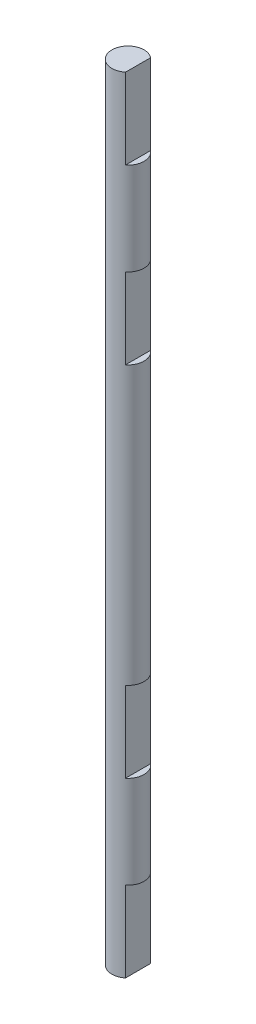
ISO-10303-21;
HEADER;
FILE_DESCRIPTION(('STEP AP214'),'2;1');
FILE_NAME('part.step','',(''),(''),'','','');
FILE_SCHEMA(('AUTOMOTIVE_DESIGN { 1 0 10303 214 1 1 1 1 }'));
ENDSEC;
DATA;
#1=APPLICATION_CONTEXT('core data for automotive mechanical design processes');
#2=APPLICATION_PROTOCOL_DEFINITION('international standard','automotive_design',2000,#1);
#3=PRODUCT_CONTEXT('',#1,'mechanical');
#4=PRODUCT('Part','Part','',(#3));
#5=PRODUCT_RELATED_PRODUCT_CATEGORY('part','',(#4));
#6=PRODUCT_DEFINITION_FORMATION('','',#4);
#7=PRODUCT_DEFINITION_CONTEXT('part definition',#1,'design');
#8=PRODUCT_DEFINITION('design','',#6,#7);
#9=PRODUCT_DEFINITION_SHAPE('','',#8);
#10=(LENGTH_UNIT() NAMED_UNIT(*) SI_UNIT(.MILLI.,.METRE.));
#11=(NAMED_UNIT(*) PLANE_ANGLE_UNIT() SI_UNIT($,.RADIAN.));
#12=(NAMED_UNIT(*) SI_UNIT($,.STERADIAN.) SOLID_ANGLE_UNIT());
#13=UNCERTAINTY_MEASURE_WITH_UNIT(LENGTH_MEASURE(1.E-05),#10,'distance_accuracy_value','');
#14=(GEOMETRIC_REPRESENTATION_CONTEXT(3) GLOBAL_UNCERTAINTY_ASSIGNED_CONTEXT((#13)) GLOBAL_UNIT_ASSIGNED_CONTEXT((#10,
#11,#12)) REPRESENTATION_CONTEXT('',''));
#15=CARTESIAN_POINT('',(0.,0.,0.));
#16=DIRECTION('',(0.,0.,1.));
#17=DIRECTION('',(1.,0.,0.));
#18=AXIS2_PLACEMENT_3D('',#15,#16,#17);
#19=CARTESIAN_POINT('',(4.,63.,-4.001));
#20=DIRECTION('',(0.,1.,0.));
#21=DIRECTION('',(0.,0.,1.));
#22=AXIS2_PLACEMENT_3D('',#19,#20,#21);
#23=PLANE('',#22);
#24=CARTESIAN_POINT('',(0.,63.,0.));
#25=DIRECTION('',(0.,1.,0.));
#26=DIRECTION('',(0.,0.,1.));
#27=AXIS2_PLACEMENT_3D('',#24,#25,#26);
#28=CIRCLE('',#27,4.);
#29=CARTESIAN_POINT('',(2.50000000000001,63.,-3.12249899919919));
#30=VERTEX_POINT('',#29);
#31=CARTESIAN_POINT('',(2.50000000000001,63.,3.12249899919918));
#32=VERTEX_POINT('',#31);
#33=EDGE_CURVE('E182',#30,#32,#28,.F.);
#34=ORIENTED_EDGE('',*,*,#33,.T.);
#35=DIRECTION('',(0.,0.,1.));
#36=VECTOR('',#35,1.);
#37=CARTESIAN_POINT('',(2.50000000000001,63.,-4.001));
#38=LINE('',#37,#36);
#39=EDGE_CURVE('E167',#30,#32,#38,.T.);
#40=ORIENTED_EDGE('',*,*,#39,.F.);
#41=EDGE_LOOP('',(#34,#40));
#42=FACE_BOUND('',#41,.T.);
#43=ADVANCED_FACE('F33',(#42),#23,.F.);
#44=CARTESIAN_POINT('',(2.50000000000001,43.,-4.001));
#45=DIRECTION('',(-1.,0.,0.));
#46=DIRECTION('',(0.,-1.,0.));
#47=AXIS2_PLACEMENT_3D('',#44,#45,#46);
#48=PLANE('',#47);
#49=DIRECTION('',(0.,-1.,0.));
#50=VECTOR('',#49,1.);
#51=CARTESIAN_POINT('',(2.50000000000003,195.,-3.12249899919918));
#52=LINE('',#51,#50);
#53=CARTESIAN_POINT('',(2.50000000000003,43.,-3.12249899919918));
#54=VERTEX_POINT('',#53);
#55=EDGE_CURVE('E175',#54,#30,#52,.F.);
#56=ORIENTED_EDGE('',*,*,#55,.T.);
#57=ORIENTED_EDGE('',*,*,#39,.T.);
#58=DIRECTION('',(0.,-1.,0.));
#59=VECTOR('',#58,1.);
#60=CARTESIAN_POINT('',(2.50000000000003,195.,3.12249899919918));
#61=LINE('',#60,#59);
#62=CARTESIAN_POINT('',(2.50000000000001,43.,3.12249899919919));
#63=VERTEX_POINT('',#62);
#64=EDGE_CURVE('E56',#63,#32,#61,.F.);
#65=ORIENTED_EDGE('',*,*,#64,.F.);
#66=DIRECTION('',(0.,0.,1.));
#67=VECTOR('',#66,1.);
#68=CARTESIAN_POINT('',(2.50000000000001,43.,-4.001));
#69=LINE('',#68,#67);
#70=EDGE_CURVE('E183',#54,#63,#69,.T.);
#71=ORIENTED_EDGE('',*,*,#70,.F.);
#72=EDGE_LOOP('',(#56,#57,#65,#71));
#73=FACE_BOUND('',#72,.T.);
#74=ADVANCED_FACE('F132',(#73),#48,.F.);
#75=CARTESIAN_POINT('',(4.,43.,-4.001));
#76=DIRECTION('',(0.,-1.,0.));
#77=DIRECTION('',(0.,0.,-1.));
#78=AXIS2_PLACEMENT_3D('',#75,#76,#77);
#79=PLANE('',#78);
#80=CARTESIAN_POINT('',(0.,43.,0.));
#81=DIRECTION('',(0.,-1.,0.));
#82=DIRECTION('',(0.,0.,-1.));
#83=AXIS2_PLACEMENT_3D('',#80,#81,#82);
#84=CIRCLE('',#83,4.);
#85=EDGE_CURVE('E170',#63,#54,#84,.F.);
#86=ORIENTED_EDGE('',*,*,#85,.T.);
#87=ORIENTED_EDGE('',*,*,#70,.T.);
#88=EDGE_LOOP('',(#86,#87));
#89=FACE_BOUND('',#88,.T.);
#90=ADVANCED_FACE('F129',(#89),#79,.F.);
#91=CARTESIAN_POINT('',(0.,195.,0.));
#92=DIRECTION('',(0.,-1.,0.));
#93=DIRECTION('',(0.,0.,-1.));
#94=AXIS2_PLACEMENT_3D('',#91,#92,#93);
#95=CYLINDRICAL_SURFACE('',#94,4.);
#96=CARTESIAN_POINT('',(0.,195.,0.));
#97=DIRECTION('',(0.,1.,0.));
#98=DIRECTION('',(0.,0.,1.));
#99=AXIS2_PLACEMENT_3D('',#96,#97,#98);
#100=CIRCLE('',#99,4.);
#101=CARTESIAN_POINT('',(2.5,195.,-3.1224989991992));
#102=VERTEX_POINT('',#101);
#103=CARTESIAN_POINT('',(2.5,195.,3.1224989991992));
#104=VERTEX_POINT('',#103);
#105=EDGE_CURVE('E11',#102,#104,#100,.T.);
#106=ORIENTED_EDGE('',*,*,#105,.F.);
#107=DIRECTION('',(0.,-1.,0.));
#108=VECTOR('',#107,1.);
#109=CARTESIAN_POINT('',(2.5,195.,-3.1224989991992));
#110=LINE('',#109,#108);
#111=CARTESIAN_POINT('',(2.5,175.,-3.1224989991992));
#112=VERTEX_POINT('',#111);
#113=EDGE_CURVE('E109',#112,#102,#110,.F.);
#114=ORIENTED_EDGE('',*,*,#113,.F.);
#115=CARTESIAN_POINT('',(0.,175.,0.));
#116=DIRECTION('',(0.,-1.,0.));
#117=DIRECTION('',(0.,0.,-1.));
#118=AXIS2_PLACEMENT_3D('',#115,#116,#117);
#119=CIRCLE('',#118,4.);
#120=CARTESIAN_POINT('',(2.5,175.,3.1224989991992));
#121=VERTEX_POINT('',#120);
#122=EDGE_CURVE('E116',#121,#112,#119,.F.);
#123=ORIENTED_EDGE('',*,*,#122,.F.);
#124=DIRECTION('',(0.,-1.,0.));
#125=VECTOR('',#124,1.);
#126=CARTESIAN_POINT('',(2.5,195.,3.1224989991992));
#127=LINE('',#126,#125);
#128=EDGE_CURVE('E106',#121,#104,#127,.F.);
#129=ORIENTED_EDGE('',*,*,#128,.T.);
#130=EDGE_LOOP('',(#106,#114,#123,#129));
#131=FACE_BOUND('',#130,.T.);
#132=DIRECTION('',(0.,-1.,0.));
#133=VECTOR('',#132,1.);
#134=CARTESIAN_POINT('',(2.5,195.,3.1224989991992));
#135=LINE('',#134,#133);
#136=CARTESIAN_POINT('',(2.50000000000001,132.,3.12249899919919));
#137=VERTEX_POINT('',#136);
#138=CARTESIAN_POINT('',(2.50000000000001,152.,3.1224989991992));
#139=VERTEX_POINT('',#138);
#140=EDGE_CURVE('E48',#137,#139,#135,.F.);
#141=ORIENTED_EDGE('',*,*,#140,.T.);
#142=CARTESIAN_POINT('',(0.,152.,0.));
#143=DIRECTION('',(0.,1.,0.));
#144=DIRECTION('',(0.,0.,1.));
#145=AXIS2_PLACEMENT_3D('',#142,#143,#144);
#146=CIRCLE('',#145,4.);
#147=CARTESIAN_POINT('',(2.50000000000001,152.,-3.12249899919919));
#148=VERTEX_POINT('',#147);
#149=EDGE_CURVE('E218',#148,#139,#146,.F.);
#150=ORIENTED_EDGE('',*,*,#149,.F.);
#151=DIRECTION('',(0.,-1.,0.));
#152=VECTOR('',#151,1.);
#153=CARTESIAN_POINT('',(2.5,195.,-3.1224989991992));
#154=LINE('',#153,#152);
#155=CARTESIAN_POINT('',(2.5,132.,-3.1224989991992));
#156=VERTEX_POINT('',#155);
#157=EDGE_CURVE('E216',#156,#148,#154,.F.);
#158=ORIENTED_EDGE('',*,*,#157,.F.);
#159=CARTESIAN_POINT('',(0.,132.,0.));
#160=DIRECTION('',(0.,-1.,0.));
#161=DIRECTION('',(0.,0.,-1.));
#162=AXIS2_PLACEMENT_3D('',#159,#160,#161);
#163=CIRCLE('',#162,4.);
#164=EDGE_CURVE('E185',#137,#156,#163,.F.);
#165=ORIENTED_EDGE('',*,*,#164,.F.);
#166=EDGE_LOOP('',(#141,#150,#158,#165));
#167=FACE_BOUND('',#166,.T.);
#168=ORIENTED_EDGE('',*,*,#64,.T.);
#169=ORIENTED_EDGE('',*,*,#33,.F.);
#170=ORIENTED_EDGE('',*,*,#55,.F.);
#171=ORIENTED_EDGE('',*,*,#85,.F.);
#172=EDGE_LOOP('',(#168,#169,#170,#171));
#173=FACE_BOUND('',#172,.T.);
#174=CARTESIAN_POINT('',(0.,20.,0.));
#175=DIRECTION('',(0.,1.,0.));
#176=DIRECTION('',(0.,0.,1.));
#177=AXIS2_PLACEMENT_3D('',#174,#175,#176);
#178=CIRCLE('',#177,4.);
#179=CARTESIAN_POINT('',(2.5,20.,-3.1224989991992));
#180=VERTEX_POINT('',#179);
#181=CARTESIAN_POINT('',(2.5,20.,3.12249899919917));
#182=VERTEX_POINT('',#181);
#183=EDGE_CURVE('E150',#180,#182,#178,.F.);
#184=ORIENTED_EDGE('',*,*,#183,.F.);
#185=DIRECTION('',(0.,-1.,0.));
#186=VECTOR('',#185,1.);
#187=CARTESIAN_POINT('',(2.50000000000003,195.,-3.12249899919917));
#188=LINE('',#187,#186);
#189=CARTESIAN_POINT('',(2.50000000000003,0.,-3.12249899919917));
#190=VERTEX_POINT('',#189);
#191=EDGE_CURVE('E156',#190,#180,#188,.F.);
#192=ORIENTED_EDGE('',*,*,#191,.F.);
#193=CARTESIAN_POINT('',(0.,0.,0.));
#194=DIRECTION('',(0.,1.,0.));
#195=DIRECTION('',(0.,0.,1.));
#196=AXIS2_PLACEMENT_3D('',#193,#194,#195);
#197=CIRCLE('',#196,4.);
#198=CARTESIAN_POINT('',(2.5,0.,3.1224989991992));
#199=VERTEX_POINT('',#198);
#200=EDGE_CURVE('E37',#190,#199,#197,.T.);
#201=ORIENTED_EDGE('',*,*,#200,.T.);
#202=DIRECTION('',(0.,-1.,0.));
#203=VECTOR('',#202,1.);
#204=CARTESIAN_POINT('',(2.50000000000003,195.,3.12249899919917));
#205=LINE('',#204,#203);
#206=EDGE_CURVE('E158',#199,#182,#205,.F.);
#207=ORIENTED_EDGE('',*,*,#206,.T.);
#208=EDGE_LOOP('',(#184,#192,#201,#207));
#209=FACE_BOUND('',#208,.T.);
#210=ADVANCED_FACE('F35',(#131,#167,#173,#209),#95,.T.);
#211=CARTESIAN_POINT('',(0.,195.,0.));
#212=DIRECTION('',(0.,1.,0.));
#213=DIRECTION('',(0.,0.,1.));
#214=AXIS2_PLACEMENT_3D('',#211,#212,#213);
#215=PLANE('',#214);
#216=DIRECTION('',(0.,0.,1.));
#217=VECTOR('',#216,1.);
#218=CARTESIAN_POINT('',(2.5,195.,-4.001));
#219=LINE('',#218,#217);
#220=EDGE_CURVE('E102',#102,#104,#219,.T.);
#221=ORIENTED_EDGE('',*,*,#220,.F.);
#222=ORIENTED_EDGE('',*,*,#105,.T.);
#223=EDGE_LOOP('',(#221,#222));
#224=FACE_BOUND('',#223,.T.);
#225=ADVANCED_FACE('F119',(#224),#215,.T.);
#226=CARTESIAN_POINT('',(0.,0.,0.));
#227=DIRECTION('',(0.,1.,0.));
#228=DIRECTION('',(0.,0.,1.));
#229=AXIS2_PLACEMENT_3D('',#226,#227,#228);
#230=PLANE('',#229);
#231=ORIENTED_EDGE('',*,*,#200,.F.);
#232=DIRECTION('',(0.,0.,1.));
#233=VECTOR('',#232,1.);
#234=CARTESIAN_POINT('',(2.5,0.,-4.001));
#235=LINE('',#234,#233);
#236=EDGE_CURVE('E160',#190,#199,#235,.T.);
#237=ORIENTED_EDGE('',*,*,#236,.T.);
#238=EDGE_LOOP('',(#231,#237));
#239=FACE_BOUND('',#238,.T.);
#240=ADVANCED_FACE('F121',(#239),#230,.F.);
#241=CARTESIAN_POINT('',(4.,20.,-4.001));
#242=DIRECTION('',(0.,1.,0.));
#243=DIRECTION('',(0.,0.,1.));
#244=AXIS2_PLACEMENT_3D('',#241,#242,#243);
#245=PLANE('',#244);
#246=ORIENTED_EDGE('',*,*,#183,.T.);
#247=DIRECTION('',(0.,0.,1.));
#248=VECTOR('',#247,1.);
#249=CARTESIAN_POINT('',(2.5,20.,-4.001));
#250=LINE('',#249,#248);
#251=EDGE_CURVE('E152',#180,#182,#250,.T.);
#252=ORIENTED_EDGE('',*,*,#251,.F.);
#253=EDGE_LOOP('',(#246,#252));
#254=FACE_BOUND('',#253,.T.);
#255=ADVANCED_FACE('F127',(#254),#245,.F.);
#256=CARTESIAN_POINT('',(2.5,0.,-4.001));
#257=DIRECTION('',(-1.,0.,0.));
#258=DIRECTION('',(0.,-1.,0.));
#259=AXIS2_PLACEMENT_3D('',#256,#257,#258);
#260=PLANE('',#259);
#261=ORIENTED_EDGE('',*,*,#191,.T.);
#262=ORIENTED_EDGE('',*,*,#251,.T.);
#263=ORIENTED_EDGE('',*,*,#206,.F.);
#264=ORIENTED_EDGE('',*,*,#236,.F.);
#265=EDGE_LOOP('',(#261,#262,#263,#264));
#266=FACE_BOUND('',#265,.T.);
#267=ADVANCED_FACE('F141',(#266),#260,.F.);
#268=CARTESIAN_POINT('',(2.5,195.,-4.001));
#269=DIRECTION('',(-1.,0.,0.));
#270=DIRECTION('',(0.,-1.,0.));
#271=AXIS2_PLACEMENT_3D('',#268,#269,#270);
#272=PLANE('',#271);
#273=ORIENTED_EDGE('',*,*,#113,.T.);
#274=ORIENTED_EDGE('',*,*,#220,.T.);
#275=ORIENTED_EDGE('',*,*,#128,.F.);
#276=DIRECTION('',(0.,0.,1.));
#277=VECTOR('',#276,1.);
#278=CARTESIAN_POINT('',(2.5,175.,-4.001));
#279=LINE('',#278,#277);
#280=EDGE_CURVE('E112',#112,#121,#279,.T.);
#281=ORIENTED_EDGE('',*,*,#280,.F.);
#282=EDGE_LOOP('',(#273,#274,#275,#281));
#283=FACE_BOUND('',#282,.T.);
#284=ADVANCED_FACE('F104',(#283),#272,.F.);
#285=CARTESIAN_POINT('',(4.,175.,-4.001));
#286=DIRECTION('',(0.,-1.,0.));
#287=DIRECTION('',(0.,0.,-1.));
#288=AXIS2_PLACEMENT_3D('',#285,#286,#287);
#289=PLANE('',#288);
#290=ORIENTED_EDGE('',*,*,#122,.T.);
#291=ORIENTED_EDGE('',*,*,#280,.T.);
#292=EDGE_LOOP('',(#290,#291));
#293=FACE_BOUND('',#292,.T.);
#294=ADVANCED_FACE('F197',(#293),#289,.F.);
#295=CARTESIAN_POINT('',(4.,152.,-4.001));
#296=DIRECTION('',(0.,1.,0.));
#297=DIRECTION('',(0.,0.,1.));
#298=AXIS2_PLACEMENT_3D('',#295,#296,#297);
#299=PLANE('',#298);
#300=ORIENTED_EDGE('',*,*,#149,.T.);
#301=DIRECTION('',(0.,0.,1.));
#302=VECTOR('',#301,1.);
#303=CARTESIAN_POINT('',(2.50000000000001,152.,-4.001));
#304=LINE('',#303,#302);
#305=EDGE_CURVE('E178',#148,#139,#304,.T.);
#306=ORIENTED_EDGE('',*,*,#305,.F.);
#307=EDGE_LOOP('',(#300,#306));
#308=FACE_BOUND('',#307,.T.);
#309=ADVANCED_FACE('F193',(#308),#299,.F.);
#310=CARTESIAN_POINT('',(2.50000000000001,152.,-4.001));
#311=DIRECTION('',(-1.,0.,0.));
#312=DIRECTION('',(0.,-1.,0.));
#313=AXIS2_PLACEMENT_3D('',#310,#311,#312);
#314=PLANE('',#313);
#315=ORIENTED_EDGE('',*,*,#157,.T.);
#316=ORIENTED_EDGE('',*,*,#305,.T.);
#317=ORIENTED_EDGE('',*,*,#140,.F.);
#318=DIRECTION('',(0.,0.,1.));
#319=VECTOR('',#318,1.);
#320=CARTESIAN_POINT('',(2.50000000000001,132.,-4.001));
#321=LINE('',#320,#319);
#322=EDGE_CURVE('E117',#156,#137,#321,.T.);
#323=ORIENTED_EDGE('',*,*,#322,.F.);
#324=EDGE_LOOP('',(#315,#316,#317,#323));
#325=FACE_BOUND('',#324,.T.);
#326=ADVANCED_FACE('F196',(#325),#314,.F.);
#327=CARTESIAN_POINT('',(4.,132.,-4.001));
#328=DIRECTION('',(0.,-1.,0.));
#329=DIRECTION('',(0.,0.,-1.));
#330=AXIS2_PLACEMENT_3D('',#327,#328,#329);
#331=PLANE('',#330);
#332=ORIENTED_EDGE('',*,*,#164,.T.);
#333=ORIENTED_EDGE('',*,*,#322,.T.);
#334=EDGE_LOOP('',(#332,#333));
#335=FACE_BOUND('',#334,.T.);
#336=ADVANCED_FACE('F201',(#335),#331,.F.);
#337=CLOSED_SHELL('',(#43,#74,#90,#210,#225,#240,#255,#267,#284,#294,#309,#326,#336));
#338=MANIFOLD_SOLID_BREP('B2',#337);
#339=ADVANCED_BREP_SHAPE_REPRESENTATION('',(#18,#338),#14);
#340=SHAPE_DEFINITION_REPRESENTATION(#9,#339);
ENDSEC;
END-ISO-10303-21;
